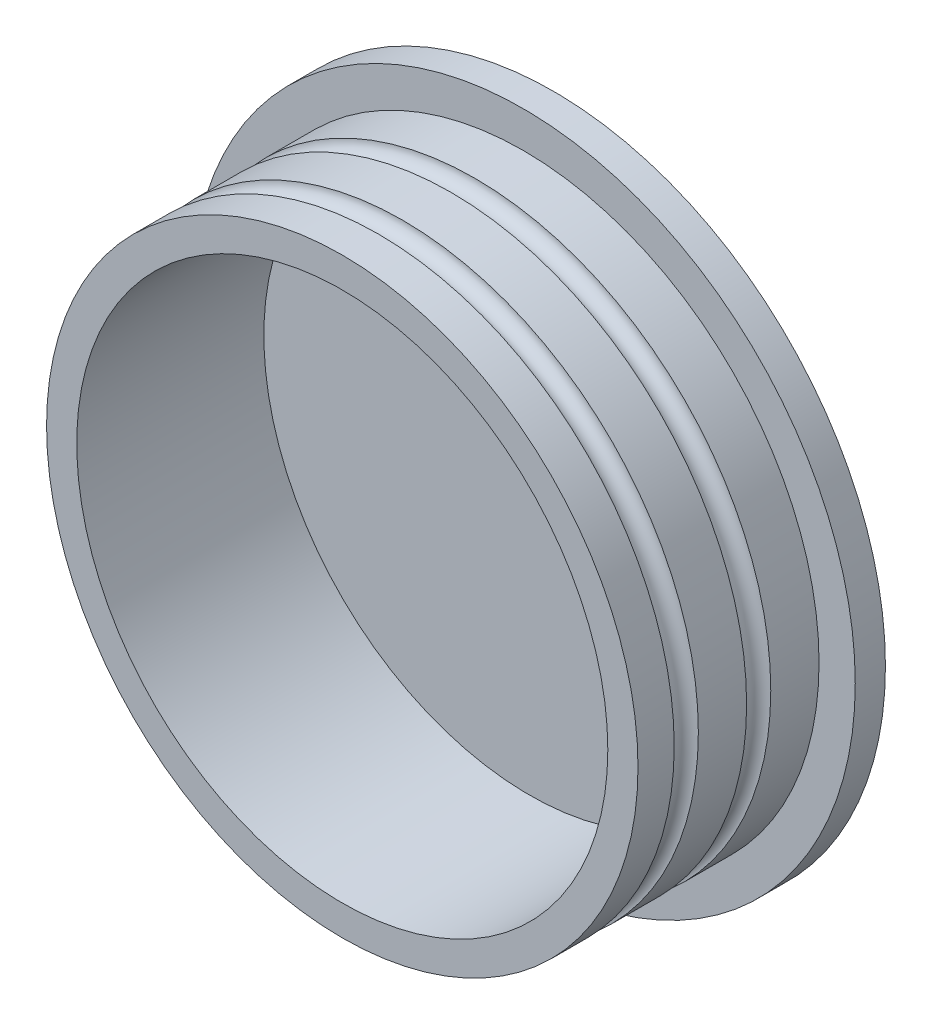
ISO-10303-21;
HEADER;
FILE_DESCRIPTION(('STEP AP214'),'2;1');
FILE_NAME('part.step','',(''),(''),'','','');
FILE_SCHEMA(('AUTOMOTIVE_DESIGN { 1 0 10303 214 1 1 1 1 }'));
ENDSEC;
DATA;
#1=APPLICATION_CONTEXT('core data for automotive mechanical design processes');
#2=APPLICATION_PROTOCOL_DEFINITION('international standard','automotive_design',2000,#1);
#3=PRODUCT_CONTEXT('',#1,'mechanical');
#4=PRODUCT('Part','Part','',(#3));
#5=PRODUCT_RELATED_PRODUCT_CATEGORY('part','',(#4));
#6=PRODUCT_DEFINITION_FORMATION('','',#4);
#7=PRODUCT_DEFINITION_CONTEXT('part definition',#1,'design');
#8=PRODUCT_DEFINITION('design','',#6,#7);
#9=PRODUCT_DEFINITION_SHAPE('','',#8);
#10=(LENGTH_UNIT() NAMED_UNIT(*) SI_UNIT(.MILLI.,.METRE.));
#11=(NAMED_UNIT(*) PLANE_ANGLE_UNIT() SI_UNIT($,.RADIAN.));
#12=(NAMED_UNIT(*) SI_UNIT($,.STERADIAN.) SOLID_ANGLE_UNIT());
#13=UNCERTAINTY_MEASURE_WITH_UNIT(LENGTH_MEASURE(1.E-05),#10,'distance_accuracy_value','');
#14=(GEOMETRIC_REPRESENTATION_CONTEXT(3) GLOBAL_UNCERTAINTY_ASSIGNED_CONTEXT((#13)) GLOBAL_UNIT_ASSIGNED_CONTEXT((#10,
#11,#12)) REPRESENTATION_CONTEXT('',''));
#15=CARTESIAN_POINT('',(0.,0.,0.));
#16=DIRECTION('',(0.,0.,1.));
#17=DIRECTION('',(1.,0.,0.));
#18=AXIS2_PLACEMENT_3D('',#15,#16,#17);
#19=CARTESIAN_POINT('',(0.,0.,35.));
#20=DIRECTION('',(0.,0.,-1.));
#21=DIRECTION('',(-1.,0.,0.));
#22=AXIS2_PLACEMENT_3D('',#19,#20,#21);
#23=CYLINDRICAL_SURFACE('',#22,49.);
#24=CARTESIAN_POINT('',(0.,0.,5.));
#25=DIRECTION('',(0.,0.,1.));
#26=DIRECTION('',(1.,0.,0.));
#27=AXIS2_PLACEMENT_3D('',#24,#25,#26);
#28=CIRCLE('',#27,49.);
#29=CARTESIAN_POINT('',(49.,0.,5.));
#30=VERTEX_POINT('',#29);
#31=EDGE_CURVE('E11',#30,#30,#28,.T.);
#32=ORIENTED_EDGE('',*,*,#31,.T.);
#33=EDGE_LOOP('',(#32));
#34=FACE_BOUND('',#33,.T.);
#35=CARTESIAN_POINT('',(0.,0.,13.));
#36=DIRECTION('',(0.,0.,1.));
#37=DIRECTION('',(1.,0.,0.));
#38=AXIS2_PLACEMENT_3D('',#35,#36,#37);
#39=CIRCLE('',#38,49.);
#40=CARTESIAN_POINT('',(49.,0.,13.));
#41=VERTEX_POINT('',#40);
#42=EDGE_CURVE('E59',#41,#41,#39,.T.);
#43=ORIENTED_EDGE('',*,*,#42,.F.);
#44=EDGE_LOOP('',(#43));
#45=FACE_BOUND('',#44,.T.);
#46=ADVANCED_FACE('F32',(#34,#45),#23,.T.);
#47=CARTESIAN_POINT('',(0.,0.,5.));
#48=DIRECTION('',(0.,0.,-1.));
#49=DIRECTION('',(-1.,0.,0.));
#50=AXIS2_PLACEMENT_3D('',#47,#48,#49);
#51=CYLINDRICAL_SURFACE('',#50,55.);
#52=CARTESIAN_POINT('',(0.,0.,5.));
#53=DIRECTION('',(0.,0.,1.));
#54=DIRECTION('',(1.,0.,0.));
#55=AXIS2_PLACEMENT_3D('',#52,#53,#54);
#56=CIRCLE('',#55,55.);
#57=CARTESIAN_POINT('',(55.,0.,5.));
#58=VERTEX_POINT('',#57);
#59=EDGE_CURVE('E40',#58,#58,#56,.T.);
#60=ORIENTED_EDGE('',*,*,#59,.F.);
#61=EDGE_LOOP('',(#60));
#62=FACE_BOUND('',#61,.T.);
#63=CARTESIAN_POINT('',(0.,0.,0.));
#64=DIRECTION('',(0.,0.,1.));
#65=DIRECTION('',(1.,0.,0.));
#66=AXIS2_PLACEMENT_3D('',#63,#64,#65);
#67=CIRCLE('',#66,55.);
#68=CARTESIAN_POINT('',(55.,0.,0.));
#69=VERTEX_POINT('',#68);
#70=EDGE_CURVE('E45',#69,#69,#67,.T.);
#71=ORIENTED_EDGE('',*,*,#70,.T.);
#72=EDGE_LOOP('',(#71));
#73=FACE_BOUND('',#72,.T.);
#74=ADVANCED_FACE('F34',(#62,#73),#51,.T.);
#75=CARTESIAN_POINT('',(0.,0.,5.));
#76=DIRECTION('',(0.,0.,1.));
#77=DIRECTION('',(1.,0.,0.));
#78=AXIS2_PLACEMENT_3D('',#75,#76,#77);
#79=PLANE('',#78);
#80=ORIENTED_EDGE('',*,*,#31,.F.);
#81=EDGE_LOOP('',(#80));
#82=FACE_BOUND('',#81,.T.);
#83=ORIENTED_EDGE('',*,*,#59,.T.);
#84=EDGE_LOOP('',(#83));
#85=FACE_BOUND('',#84,.T.);
#86=ADVANCED_FACE('F96',(#82,#85),#79,.T.);
#87=CARTESIAN_POINT('',(0.,0.,0.));
#88=DIRECTION('',(0.,0.,1.));
#89=DIRECTION('',(1.,0.,0.));
#90=AXIS2_PLACEMENT_3D('',#87,#88,#89);
#91=PLANE('',#90);
#92=ORIENTED_EDGE('',*,*,#70,.F.);
#93=EDGE_LOOP('',(#92));
#94=FACE_BOUND('',#93,.T.);
#95=ADVANCED_FACE('F101',(#94),#91,.F.);
#96=CARTESIAN_POINT('',(0.,0.,15.));
#97=DIRECTION('',(0.,0.,1.));
#98=DIRECTION('',(1.,0.,0.));
#99=AXIS2_PLACEMENT_3D('',#96,#97,#98);
#100=TOROIDAL_SURFACE('',#99,49.,2.);
#101=ORIENTED_EDGE('',*,*,#42,.T.);
#102=EDGE_LOOP('',(#101));
#103=FACE_BOUND('',#102,.T.);
#104=CARTESIAN_POINT('',(0.,0.,17.));
#105=DIRECTION('',(0.,0.,-1.));
#106=DIRECTION('',(-1.,0.,0.));
#107=AXIS2_PLACEMENT_3D('',#104,#105,#106);
#108=CIRCLE('',#107,49.);
#109=CARTESIAN_POINT('',(-49.,0.,17.));
#110=VERTEX_POINT('',#109);
#111=EDGE_CURVE('E36',#110,#110,#108,.T.);
#112=ORIENTED_EDGE('',*,*,#111,.T.);
#113=EDGE_LOOP('',(#112));
#114=FACE_BOUND('',#113,.T.);
#115=ADVANCED_FACE('F89',(#103,#114),#100,.F.);
#116=CARTESIAN_POINT('',(0.,0.,25.));
#117=DIRECTION('',(0.,0.,1.));
#118=DIRECTION('',(1.,0.,0.));
#119=AXIS2_PLACEMENT_3D('',#116,#117,#118);
#120=CIRCLE('',#119,49.);
#121=CARTESIAN_POINT('',(49.,0.,25.));
#122=VERTEX_POINT('',#121);
#123=EDGE_CURVE('E53',#122,#122,#120,.T.);
#124=ORIENTED_EDGE('',*,*,#123,.F.);
#125=EDGE_LOOP('',(#124));
#126=FACE_BOUND('',#125,.T.);
#127=ORIENTED_EDGE('',*,*,#111,.F.);
#128=EDGE_LOOP('',(#127));
#129=FACE_BOUND('',#128,.T.);
#130=ADVANCED_FACE('F76',(#126,#129),#23,.T.);
#131=CARTESIAN_POINT('',(0.,0.,27.));
#132=DIRECTION('',(0.,0.,1.));
#133=DIRECTION('',(1.,0.,0.));
#134=AXIS2_PLACEMENT_3D('',#131,#132,#133);
#135=TOROIDAL_SURFACE('',#134,49.,2.);
#136=ORIENTED_EDGE('',*,*,#123,.T.);
#137=EDGE_LOOP('',(#136));
#138=FACE_BOUND('',#137,.T.);
#139=CARTESIAN_POINT('',(0.,0.,29.));
#140=DIRECTION('',(0.,0.,-1.));
#141=DIRECTION('',(-1.,0.,0.));
#142=AXIS2_PLACEMENT_3D('',#139,#140,#141);
#143=CIRCLE('',#142,49.);
#144=CARTESIAN_POINT('',(-49.,0.,29.));
#145=VERTEX_POINT('',#144);
#146=EDGE_CURVE('E56',#145,#145,#143,.T.);
#147=ORIENTED_EDGE('',*,*,#146,.T.);
#148=EDGE_LOOP('',(#147));
#149=FACE_BOUND('',#148,.T.);
#150=ADVANCED_FACE('F79',(#138,#149),#135,.F.);
#151=CARTESIAN_POINT('',(0.,0.,35.));
#152=DIRECTION('',(0.,0.,1.));
#153=DIRECTION('',(1.,0.,0.));
#154=AXIS2_PLACEMENT_3D('',#151,#152,#153);
#155=PLANE('',#154);
#156=CARTESIAN_POINT('',(0.,0.,35.));
#157=DIRECTION('',(0.,0.,1.));
#158=DIRECTION('',(1.,0.,0.));
#159=AXIS2_PLACEMENT_3D('',#156,#157,#158);
#160=CIRCLE('',#159,44.);
#161=CARTESIAN_POINT('',(44.,0.,35.));
#162=VERTEX_POINT('',#161);
#163=EDGE_CURVE('E123',#162,#162,#160,.T.);
#164=ORIENTED_EDGE('',*,*,#163,.F.);
#165=EDGE_LOOP('',(#164));
#166=FACE_BOUND('',#165,.T.);
#167=CARTESIAN_POINT('',(0.,0.,35.));
#168=DIRECTION('',(0.,0.,1.));
#169=DIRECTION('',(1.,0.,0.));
#170=AXIS2_PLACEMENT_3D('',#167,#168,#169);
#171=CIRCLE('',#170,49.);
#172=CARTESIAN_POINT('',(49.,0.,35.));
#173=VERTEX_POINT('',#172);
#174=EDGE_CURVE('E48',#173,#173,#171,.T.);
#175=ORIENTED_EDGE('',*,*,#174,.T.);
#176=EDGE_LOOP('',(#175));
#177=FACE_BOUND('',#176,.T.);
#178=ADVANCED_FACE('F69',(#166,#177),#155,.T.);
#179=ORIENTED_EDGE('',*,*,#174,.F.);
#180=EDGE_LOOP('',(#179));
#181=FACE_BOUND('',#180,.T.);
#182=ORIENTED_EDGE('',*,*,#146,.F.);
#183=EDGE_LOOP('',(#182));
#184=FACE_BOUND('',#183,.T.);
#185=ADVANCED_FACE('F71',(#181,#184),#23,.T.);
#186=CARTESIAN_POINT('',(0.,0.,-124.450793488832));
#187=DIRECTION('',(0.,0.,1.));
#188=DIRECTION('',(1.,0.,0.));
#189=AXIS2_PLACEMENT_3D('',#186,#187,#188);
#190=CYLINDRICAL_SURFACE('',#189,44.);
#191=CARTESIAN_POINT('',(0.,0.,4.));
#192=DIRECTION('',(0.,0.,1.));
#193=DIRECTION('',(1.,0.,0.));
#194=AXIS2_PLACEMENT_3D('',#191,#192,#193);
#195=CIRCLE('',#194,44.);
#196=CARTESIAN_POINT('',(44.,0.,4.));
#197=VERTEX_POINT('',#196);
#198=EDGE_CURVE('E57',#197,#197,#195,.F.);
#199=ORIENTED_EDGE('',*,*,#198,.T.);
#200=EDGE_LOOP('',(#199));
#201=FACE_BOUND('',#200,.T.);
#202=ORIENTED_EDGE('',*,*,#163,.T.);
#203=EDGE_LOOP('',(#202));
#204=FACE_BOUND('',#203,.T.);
#205=ADVANCED_FACE('F74',(#201,#204),#190,.F.);
#206=CARTESIAN_POINT('',(0.,0.,4.));
#207=DIRECTION('',(0.,0.,1.));
#208=DIRECTION('',(1.,0.,0.));
#209=AXIS2_PLACEMENT_3D('',#206,#207,#208);
#210=PLANE('',#209);
#211=ORIENTED_EDGE('',*,*,#198,.F.);
#212=EDGE_LOOP('',(#211));
#213=FACE_BOUND('',#212,.T.);
#214=ADVANCED_FACE('F115',(#213),#210,.T.);
#215=CLOSED_SHELL('',(#46,#74,#86,#95,#115,#130,#150,#178,#185,#205,#214));
#216=MANIFOLD_SOLID_BREP('B2',#215);
#217=ADVANCED_BREP_SHAPE_REPRESENTATION('',(#18,#216),#14);
#218=SHAPE_DEFINITION_REPRESENTATION(#9,#217);
ENDSEC;
END-ISO-10303-21;
